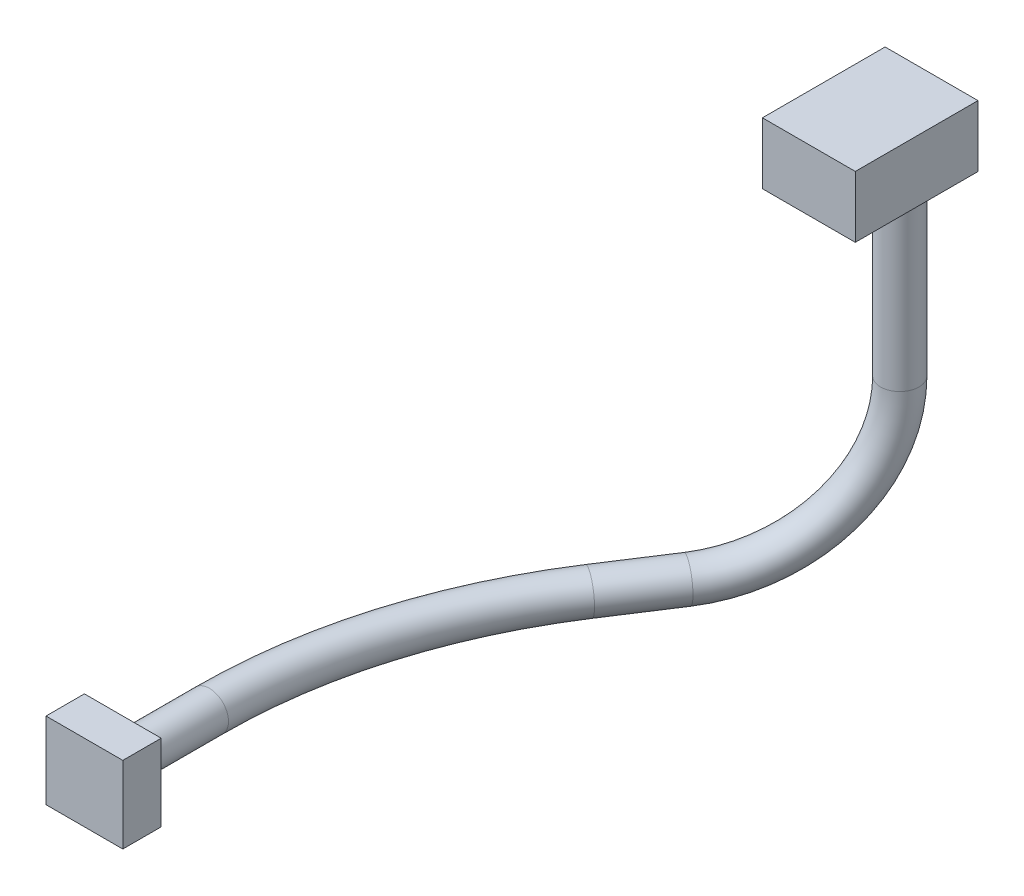
ISO-10303-21;
HEADER;
FILE_DESCRIPTION(('STEP AP214'),'2;1');
FILE_NAME('part.step','',(''),(''),'','','');
FILE_SCHEMA(('AUTOMOTIVE_DESIGN { 1 0 10303 214 1 1 1 1 }'));
ENDSEC;
DATA;
#1=APPLICATION_CONTEXT('core data for automotive mechanical design processes');
#2=APPLICATION_PROTOCOL_DEFINITION('international standard','automotive_design',2000,#1);
#3=PRODUCT_CONTEXT('',#1,'mechanical');
#4=PRODUCT('Part','Part','',(#3));
#5=PRODUCT_RELATED_PRODUCT_CATEGORY('part','',(#4));
#6=PRODUCT_DEFINITION_FORMATION('','',#4);
#7=PRODUCT_DEFINITION_CONTEXT('part definition',#1,'design');
#8=PRODUCT_DEFINITION('design','',#6,#7);
#9=PRODUCT_DEFINITION_SHAPE('','',#8);
#10=(LENGTH_UNIT() NAMED_UNIT(*) SI_UNIT(.MILLI.,.METRE.));
#11=(NAMED_UNIT(*) PLANE_ANGLE_UNIT() SI_UNIT($,.RADIAN.));
#12=(NAMED_UNIT(*) SI_UNIT($,.STERADIAN.) SOLID_ANGLE_UNIT());
#13=UNCERTAINTY_MEASURE_WITH_UNIT(LENGTH_MEASURE(1.E-05),#10,'distance_accuracy_value','');
#14=(GEOMETRIC_REPRESENTATION_CONTEXT(3) GLOBAL_UNCERTAINTY_ASSIGNED_CONTEXT((#13)) GLOBAL_UNIT_ASSIGNED_CONTEXT((#10,
#11,#12)) REPRESENTATION_CONTEXT('',''));
#15=CARTESIAN_POINT('',(0.,0.,0.));
#16=DIRECTION('',(0.,0.,1.));
#17=DIRECTION('',(1.,0.,0.));
#18=AXIS2_PLACEMENT_3D('',#15,#16,#17);
#19=CARTESIAN_POINT('',(0.,0.,0.));
#20=DIRECTION('',(0.,0.,-1.));
#21=DIRECTION('',(-1.,0.,0.));
#22=AXIS2_PLACEMENT_3D('',#19,#20,#21);
#23=CYLINDRICAL_SURFACE('',#22,2.5);
#24=CARTESIAN_POINT('',(0.,0.,-11.2650553526543));
#25=DIRECTION('',(0.,0.,1.));
#26=DIRECTION('',(0.838670567945424,-0.544639035015028,0.));
#27=AXIS2_PLACEMENT_3D('',#24,#25,#26);
#28=CIRCLE('',#27,2.5);
#29=CARTESIAN_POINT('',(-2.5,0.,-11.2650553526543));
#30=VERTEX_POINT('',#29);
#31=EDGE_CURVE('E184',#30,#30,#28,.T.);
#32=ORIENTED_EDGE('',*,*,#31,.T.);
#33=EDGE_LOOP('',(#32));
#34=FACE_BOUND('',#33,.T.);
#35=CARTESIAN_POINT('',(0.,0.,0.));
#36=DIRECTION('',(0.,0.,1.));
#37=DIRECTION('',(0.838670567945424,-0.544639035015028,0.));
#38=AXIS2_PLACEMENT_3D('',#35,#36,#37);
#39=CIRCLE('',#38,2.5);
#40=CARTESIAN_POINT('',(2.09667641986356,-1.36159758753757,0.));
#41=VERTEX_POINT('',#40);
#42=EDGE_CURVE('E181',#41,#41,#39,.T.);
#43=ORIENTED_EDGE('',*,*,#42,.F.);
#44=EDGE_LOOP('',(#43));
#45=FACE_BOUND('',#44,.T.);
#46=ADVANCED_FACE('F52',(#34,#45),#23,.T.);
#47=CARTESIAN_POINT('',(70.,0.,-11.2650553526543));
#48=DIRECTION('',(0.,-1.,0.));
#49=DIRECTION('',(0.,0.,-1.));
#50=AXIS2_PLACEMENT_3D('',#47,#48,#49);
#51=TOROIDAL_SURFACE('',#50,70.,2.5);
#52=CARTESIAN_POINT('',(11.2930602438204,0.,-49.3897878037063));
#53=DIRECTION('',(-0.544639035015029,0.,0.838670567945423));
#54=DIRECTION('',(0.703368321537899,-0.544639035015028,0.456772728821302));
#55=AXIS2_PLACEMENT_3D('',#52,#53,#54);
#56=CIRCLE('',#55,2.5);
#57=CARTESIAN_POINT('',(9.19638382395683,0.,-50.7513853912439));
#58=VERTEX_POINT('',#57);
#59=EDGE_CURVE('E187',#58,#58,#56,.T.);
#60=CARTESIAN_POINT('',(70.,0.,-11.2650553526543));
#61=DIRECTION('',(0.,-1.,0.));
#62=DIRECTION('',(0.,0.,-1.));
#63=AXIS2_PLACEMENT_3D('',#60,#61,#62);
#64=CIRCLE('',#63,72.5);
#65=EDGE_CURVE('',#30,#58,#64,.T.);
#66=ORIENTED_EDGE('',*,*,#31,.F.);
#67=ORIENTED_EDGE('',*,*,#59,.T.);
#68=ORIENTED_EDGE('',*,*,#65,.T.);
#69=ORIENTED_EDGE('',*,*,#65,.F.);
#70=EDGE_LOOP('',(#66,#68,#67,#69));
#71=FACE_BOUND('',#70,.T.);
#72=ADVANCED_FACE('F205',(#71),#51,.T.);
#73=CARTESIAN_POINT('',(11.2930602438204,0.,-49.3897878037063));
#74=DIRECTION('',(0.544639035015028,0.,-0.838670567945423));
#75=DIRECTION('',(-0.838670567945423,0.,-0.544639035015028));
#76=AXIS2_PLACEMENT_3D('',#73,#74,#75);
#77=CYLINDRICAL_SURFACE('',#76,2.5);
#78=CARTESIAN_POINT('',(16.3391710504509,0.,-57.1601170383627));
#79=DIRECTION('',(-0.544639035015028,0.,0.838670567945423));
#80=DIRECTION('',(0.703368321537899,-0.544639035015028,0.456772728821301));
#81=AXIS2_PLACEMENT_3D('',#78,#79,#80);
#82=CIRCLE('',#81,2.5);
#83=CARTESIAN_POINT('',(16.3391710504509,-2.5,-57.1601170383627));
#84=VERTEX_POINT('',#83);
#85=EDGE_CURVE('E62',#84,#84,#82,.T.);
#86=ORIENTED_EDGE('',*,*,#85,.T.);
#87=EDGE_LOOP('',(#86));
#88=FACE_BOUND('',#87,.T.);
#89=ORIENTED_EDGE('',*,*,#59,.F.);
#90=EDGE_LOOP('',(#89));
#91=FACE_BOUND('',#90,.T.);
#92=ADVANCED_FACE('F193',(#88,#91),#77,.T.);
#93=CARTESIAN_POINT('',(16.3391710504508,20.,-57.1601170383627));
#94=DIRECTION('',(0.838670567945424,0.,0.544639035015028));
#95=DIRECTION('',(0.544639035015028,0.,-0.838670567945424));
#96=AXIS2_PLACEMENT_3D('',#93,#94,#95);
#97=TOROIDAL_SURFACE('',#96,20.,2.5);
#98=CARTESIAN_POINT('',(27.2319517507514,20.,-73.9335283972712));
#99=DIRECTION('',(0.,-1.,0.));
#100=DIRECTION('',(1.,0.,0.));
#101=AXIS2_PLACEMENT_3D('',#98,#99,#100);
#102=CIRCLE('',#101,2.5);
#103=CARTESIAN_POINT('',(28.593549338289,20.,-76.0302048171348));
#104=VERTEX_POINT('',#103);
#105=EDGE_CURVE('E12',#104,#104,#102,.T.);
#106=CARTESIAN_POINT('',(16.3391710504508,20.,-57.1601170383627));
#107=DIRECTION('',(0.838670567945424,0.,0.544639035015028));
#108=DIRECTION('',(0.544639035015028,0.,-0.838670567945424));
#109=AXIS2_PLACEMENT_3D('',#106,#107,#108);
#110=CIRCLE('',#109,22.5);
#111=EDGE_CURVE('',#84,#104,#110,.T.);
#112=ORIENTED_EDGE('',*,*,#85,.F.);
#113=ORIENTED_EDGE('',*,*,#105,.T.);
#114=ORIENTED_EDGE('',*,*,#111,.T.);
#115=ORIENTED_EDGE('',*,*,#111,.F.);
#116=EDGE_LOOP('',(#112,#114,#113,#115));
#117=FACE_BOUND('',#116,.T.);
#118=ADVANCED_FACE('F196',(#117),#97,.T.);
#119=CARTESIAN_POINT('',(27.2319517507514,20.,-73.9335283972712));
#120=DIRECTION('',(0.,1.,0.));
#121=DIRECTION('',(-1.,0.,0.));
#122=AXIS2_PLACEMENT_3D('',#119,#120,#121);
#123=CYLINDRICAL_SURFACE('',#122,2.5);
#124=CARTESIAN_POINT('',(27.2319517507514,44.,-73.9335283972712));
#125=DIRECTION('',(0.,-1.,0.));
#126=DIRECTION('',(1.,0.,0.));
#127=AXIS2_PLACEMENT_3D('',#124,#125,#126);
#128=CIRCLE('',#127,2.5);
#129=CARTESIAN_POINT('',(29.7319517507514,44.,-73.9335283972712));
#130=VERTEX_POINT('',#129);
#131=EDGE_CURVE('E56',#130,#130,#128,.T.);
#132=ORIENTED_EDGE('',*,*,#131,.T.);
#133=EDGE_LOOP('',(#132));
#134=FACE_BOUND('',#133,.T.);
#135=ORIENTED_EDGE('',*,*,#105,.F.);
#136=EDGE_LOOP('',(#135));
#137=FACE_BOUND('',#136,.T.);
#138=ADVANCED_FACE('F54',(#134,#137),#123,.T.);
#139=CARTESIAN_POINT('',(5.,5.,5.));
#140=DIRECTION('',(-1.,0.,0.));
#141=DIRECTION('',(0.,-1.,0.));
#142=AXIS2_PLACEMENT_3D('',#139,#140,#141);
#143=PLANE('',#142);
#144=DIRECTION('',(0.,1.,0.));
#145=VECTOR('',#144,1.);
#146=CARTESIAN_POINT('',(5.,5.,0.));
#147=LINE('',#146,#145);
#148=CARTESIAN_POINT('',(5.,-5.,0.));
#149=VERTEX_POINT('',#148);
#150=CARTESIAN_POINT('',(5.,5.,0.));
#151=VERTEX_POINT('',#150);
#152=EDGE_CURVE('E156',#149,#151,#147,.T.);
#153=ORIENTED_EDGE('',*,*,#152,.T.);
#154=DIRECTION('',(0.,0.,-1.));
#155=VECTOR('',#154,1.);
#156=CARTESIAN_POINT('',(5.,5.,5.));
#157=LINE('',#156,#155);
#158=CARTESIAN_POINT('',(5.,5.,5.));
#159=VERTEX_POINT('',#158);
#160=EDGE_CURVE('E179',#159,#151,#157,.T.);
#161=ORIENTED_EDGE('',*,*,#160,.F.);
#162=DIRECTION('',(0.,1.,0.));
#163=VECTOR('',#162,1.);
#164=CARTESIAN_POINT('',(5.,5.,5.));
#165=LINE('',#164,#163);
#166=CARTESIAN_POINT('',(5.,-5.,5.));
#167=VERTEX_POINT('',#166);
#168=EDGE_CURVE('E161',#167,#159,#165,.T.);
#169=ORIENTED_EDGE('',*,*,#168,.F.);
#170=DIRECTION('',(0.,0.,-1.));
#171=VECTOR('',#170,1.);
#172=CARTESIAN_POINT('',(5.,-5.,5.));
#173=LINE('',#172,#171);
#174=EDGE_CURVE('E167',#167,#149,#173,.T.);
#175=ORIENTED_EDGE('',*,*,#174,.T.);
#176=EDGE_LOOP('',(#153,#161,#169,#175));
#177=FACE_BOUND('',#176,.T.);
#178=ADVANCED_FACE('F203',(#177),#143,.F.);
#179=CARTESIAN_POINT('',(-5.,5.,5.));
#180=DIRECTION('',(0.,-1.,0.));
#181=DIRECTION('',(0.,0.,-1.));
#182=AXIS2_PLACEMENT_3D('',#179,#180,#181);
#183=PLANE('',#182);
#184=DIRECTION('',(-1.,0.,0.));
#185=VECTOR('',#184,1.);
#186=CARTESIAN_POINT('',(-5.,5.,0.));
#187=LINE('',#186,#185);
#188=CARTESIAN_POINT('',(-5.,5.,0.));
#189=VERTEX_POINT('',#188);
#190=EDGE_CURVE('E170',#151,#189,#187,.T.);
#191=ORIENTED_EDGE('',*,*,#190,.T.);
#192=DIRECTION('',(0.,0.,-1.));
#193=VECTOR('',#192,1.);
#194=CARTESIAN_POINT('',(-5.,5.,5.));
#195=LINE('',#194,#193);
#196=CARTESIAN_POINT('',(-5.,5.,5.));
#197=VERTEX_POINT('',#196);
#198=EDGE_CURVE('E177',#197,#189,#195,.T.);
#199=ORIENTED_EDGE('',*,*,#198,.F.);
#200=DIRECTION('',(-1.,0.,0.));
#201=VECTOR('',#200,1.);
#202=CARTESIAN_POINT('',(-5.,5.,5.));
#203=LINE('',#202,#201);
#204=EDGE_CURVE('E102',#159,#197,#203,.T.);
#205=ORIENTED_EDGE('',*,*,#204,.F.);
#206=ORIENTED_EDGE('',*,*,#160,.T.);
#207=EDGE_LOOP('',(#191,#199,#205,#206));
#208=FACE_BOUND('',#207,.T.);
#209=ADVANCED_FACE('F216',(#208),#183,.F.);
#210=CARTESIAN_POINT('',(-5.,5.,5.));
#211=DIRECTION('',(1.,0.,0.));
#212=DIRECTION('',(0.,1.,0.));
#213=AXIS2_PLACEMENT_3D('',#210,#211,#212);
#214=PLANE('',#213);
#215=DIRECTION('',(0.,-1.,0.));
#216=VECTOR('',#215,1.);
#217=CARTESIAN_POINT('',(-5.,5.,0.));
#218=LINE('',#217,#216);
#219=CARTESIAN_POINT('',(-5.,-5.,0.));
#220=VERTEX_POINT('',#219);
#221=EDGE_CURVE('E88',#189,#220,#218,.T.);
#222=ORIENTED_EDGE('',*,*,#221,.T.);
#223=DIRECTION('',(0.,0.,-1.));
#224=VECTOR('',#223,1.);
#225=CARTESIAN_POINT('',(-5.,-5.,5.));
#226=LINE('',#225,#224);
#227=CARTESIAN_POINT('',(-5.,-5.,5.));
#228=VERTEX_POINT('',#227);
#229=EDGE_CURVE('E175',#228,#220,#226,.T.);
#230=ORIENTED_EDGE('',*,*,#229,.F.);
#231=DIRECTION('',(0.,-1.,0.));
#232=VECTOR('',#231,1.);
#233=CARTESIAN_POINT('',(-5.,5.,5.));
#234=LINE('',#233,#232);
#235=EDGE_CURVE('E164',#197,#228,#234,.T.);
#236=ORIENTED_EDGE('',*,*,#235,.F.);
#237=ORIENTED_EDGE('',*,*,#198,.T.);
#238=EDGE_LOOP('',(#222,#230,#236,#237));
#239=FACE_BOUND('',#238,.T.);
#240=ADVANCED_FACE('F220',(#239),#214,.F.);
#241=CARTESIAN_POINT('',(-5.,-5.,5.));
#242=DIRECTION('',(0.,1.,0.));
#243=DIRECTION('',(0.,0.,1.));
#244=AXIS2_PLACEMENT_3D('',#241,#242,#243);
#245=PLANE('',#244);
#246=DIRECTION('',(1.,0.,0.));
#247=VECTOR('',#246,1.);
#248=CARTESIAN_POINT('',(-5.,-5.,0.));
#249=LINE('',#248,#247);
#250=EDGE_CURVE('E94',#220,#149,#249,.T.);
#251=ORIENTED_EDGE('',*,*,#250,.T.);
#252=ORIENTED_EDGE('',*,*,#174,.F.);
#253=DIRECTION('',(1.,0.,0.));
#254=VECTOR('',#253,1.);
#255=CARTESIAN_POINT('',(-5.,-5.,5.));
#256=LINE('',#255,#254);
#257=EDGE_CURVE('E70',#228,#167,#256,.T.);
#258=ORIENTED_EDGE('',*,*,#257,.F.);
#259=ORIENTED_EDGE('',*,*,#229,.T.);
#260=EDGE_LOOP('',(#251,#252,#258,#259));
#261=FACE_BOUND('',#260,.T.);
#262=ADVANCED_FACE('F223',(#261),#245,.F.);
#263=CARTESIAN_POINT('',(0.,0.,5.));
#264=DIRECTION('',(0.,0.,1.));
#265=DIRECTION('',(1.,0.,0.));
#266=AXIS2_PLACEMENT_3D('',#263,#264,#265);
#267=PLANE('',#266);
#268=ORIENTED_EDGE('',*,*,#168,.T.);
#269=ORIENTED_EDGE('',*,*,#204,.T.);
#270=ORIENTED_EDGE('',*,*,#235,.T.);
#271=ORIENTED_EDGE('',*,*,#257,.T.);
#272=EDGE_LOOP('',(#268,#269,#270,#271));
#273=FACE_BOUND('',#272,.T.);
#274=ADVANCED_FACE('F226',(#273),#267,.T.);
#275=CARTESIAN_POINT('',(0.,0.,0.));
#276=DIRECTION('',(0.,0.,1.));
#277=DIRECTION('',(1.,0.,0.));
#278=AXIS2_PLACEMENT_3D('',#275,#276,#277);
#279=PLANE('',#278);
#280=ORIENTED_EDGE('',*,*,#42,.T.);
#281=EDGE_LOOP('',(#280));
#282=FACE_BOUND('',#281,.T.);
#283=ORIENTED_EDGE('',*,*,#152,.F.);
#284=ORIENTED_EDGE('',*,*,#250,.F.);
#285=ORIENTED_EDGE('',*,*,#221,.F.);
#286=ORIENTED_EDGE('',*,*,#190,.F.);
#287=EDGE_LOOP('',(#283,#284,#285,#286));
#288=FACE_BOUND('',#287,.T.);
#289=ADVANCED_FACE('F227',(#282,#288),#279,.F.);
#290=CARTESIAN_POINT('',(21.1852247097513,52.,-78.070467629394));
#291=DIRECTION('',(1.,0.,0.));
#292=DIRECTION('',(0.,0.,-1.));
#293=AXIS2_PLACEMENT_3D('',#290,#291,#292);
#294=PLANE('',#293);
#295=DIRECTION('',(0.,0.,1.));
#296=VECTOR('',#295,1.);
#297=CARTESIAN_POINT('',(21.1852247097513,44.,-78.070467629394));
#298=LINE('',#297,#296);
#299=CARTESIAN_POINT('',(21.1852247097513,44.,-78.070467629394));
#300=VERTEX_POINT('',#299);
#301=CARTESIAN_POINT('',(21.1852247097513,44.,-62.0943429830169));
#302=VERTEX_POINT('',#301);
#303=EDGE_CURVE('E153',#300,#302,#298,.T.);
#304=ORIENTED_EDGE('',*,*,#303,.T.);
#305=DIRECTION('',(0.,-1.,0.));
#306=VECTOR('',#305,1.);
#307=CARTESIAN_POINT('',(21.1852247097513,52.,-62.0943429830169));
#308=LINE('',#307,#306);
#309=CARTESIAN_POINT('',(21.1852247097513,52.,-62.0943429830169));
#310=VERTEX_POINT('',#309);
#311=EDGE_CURVE('E133',#310,#302,#308,.T.);
#312=ORIENTED_EDGE('',*,*,#311,.F.);
#313=DIRECTION('',(0.,0.,1.));
#314=VECTOR('',#313,1.);
#315=CARTESIAN_POINT('',(21.1852247097513,52.,-78.070467629394));
#316=LINE('',#315,#314);
#317=CARTESIAN_POINT('',(21.1852247097513,52.,-78.070467629394));
#318=VERTEX_POINT('',#317);
#319=EDGE_CURVE('E140',#318,#310,#316,.T.);
#320=ORIENTED_EDGE('',*,*,#319,.F.);
#321=DIRECTION('',(0.,-1.,0.));
#322=VECTOR('',#321,1.);
#323=CARTESIAN_POINT('',(21.1852247097513,52.,-78.070467629394));
#324=LINE('',#323,#322);
#325=EDGE_CURVE('E397',#318,#300,#324,.T.);
#326=ORIENTED_EDGE('',*,*,#325,.T.);
#327=EDGE_LOOP('',(#304,#312,#320,#326));
#328=FACE_BOUND('',#327,.T.);
#329=ADVANCED_FACE('F151',(#328),#294,.F.);
#330=CARTESIAN_POINT('',(21.1852247097513,52.,-62.0943429830169));
#331=DIRECTION('',(0.,0.,-1.));
#332=DIRECTION('',(-1.,0.,0.));
#333=AXIS2_PLACEMENT_3D('',#330,#331,#332);
#334=PLANE('',#333);
#335=DIRECTION('',(1.,0.,0.));
#336=VECTOR('',#335,1.);
#337=CARTESIAN_POINT('',(21.1852247097513,44.,-62.0943429830169));
#338=LINE('',#337,#336);
#339=CARTESIAN_POINT('',(33.2786787917515,44.,-62.0943429830169));
#340=VERTEX_POINT('',#339);
#341=EDGE_CURVE('E388',#302,#340,#338,.T.);
#342=ORIENTED_EDGE('',*,*,#341,.T.);
#343=DIRECTION('',(0.,-1.,0.));
#344=VECTOR('',#343,1.);
#345=CARTESIAN_POINT('',(33.2786787917515,52.,-62.0943429830169));
#346=LINE('',#345,#344);
#347=CARTESIAN_POINT('',(33.2786787917515,52.,-62.0943429830169));
#348=VERTEX_POINT('',#347);
#349=EDGE_CURVE('E136',#348,#340,#346,.T.);
#350=ORIENTED_EDGE('',*,*,#349,.F.);
#351=DIRECTION('',(1.,0.,0.));
#352=VECTOR('',#351,1.);
#353=CARTESIAN_POINT('',(21.1852247097513,52.,-62.0943429830169));
#354=LINE('',#353,#352);
#355=EDGE_CURVE('E129',#310,#348,#354,.T.);
#356=ORIENTED_EDGE('',*,*,#355,.F.);
#357=ORIENTED_EDGE('',*,*,#311,.T.);
#358=EDGE_LOOP('',(#342,#350,#356,#357));
#359=FACE_BOUND('',#358,.T.);
#360=ADVANCED_FACE('F131',(#359),#334,.F.);
#361=CARTESIAN_POINT('',(33.2786787917515,52.,-78.070467629394));
#362=DIRECTION('',(-1.,0.,0.));
#363=DIRECTION('',(0.,0.,1.));
#364=AXIS2_PLACEMENT_3D('',#361,#362,#363);
#365=PLANE('',#364);
#366=DIRECTION('',(0.,0.,-1.));
#367=VECTOR('',#366,1.);
#368=CARTESIAN_POINT('',(33.2786787917515,44.,-78.070467629394));
#369=LINE('',#368,#367);
#370=CARTESIAN_POINT('',(33.2786787917515,44.,-78.070467629394));
#371=VERTEX_POINT('',#370);
#372=EDGE_CURVE('E390',#340,#371,#369,.T.);
#373=ORIENTED_EDGE('',*,*,#372,.T.);
#374=DIRECTION('',(0.,-1.,0.));
#375=VECTOR('',#374,1.);
#376=CARTESIAN_POINT('',(33.2786787917515,52.,-78.070467629394));
#377=LINE('',#376,#375);
#378=CARTESIAN_POINT('',(33.2786787917515,52.,-78.070467629394));
#379=VERTEX_POINT('',#378);
#380=EDGE_CURVE('E157',#379,#371,#377,.T.);
#381=ORIENTED_EDGE('',*,*,#380,.F.);
#382=DIRECTION('',(0.,0.,-1.));
#383=VECTOR('',#382,1.);
#384=CARTESIAN_POINT('',(33.2786787917515,52.,-78.070467629394));
#385=LINE('',#384,#383);
#386=EDGE_CURVE('E139',#348,#379,#385,.T.);
#387=ORIENTED_EDGE('',*,*,#386,.F.);
#388=ORIENTED_EDGE('',*,*,#349,.T.);
#389=EDGE_LOOP('',(#373,#381,#387,#388));
#390=FACE_BOUND('',#389,.T.);
#391=ADVANCED_FACE('F237',(#390),#365,.F.);
#392=CARTESIAN_POINT('',(21.1852247097513,52.,-78.070467629394));
#393=DIRECTION('',(0.,0.,1.));
#394=DIRECTION('',(1.,0.,0.));
#395=AXIS2_PLACEMENT_3D('',#392,#393,#394);
#396=PLANE('',#395);
#397=DIRECTION('',(-1.,0.,0.));
#398=VECTOR('',#397,1.);
#399=CARTESIAN_POINT('',(21.1852247097513,44.,-78.070467629394));
#400=LINE('',#399,#398);
#401=EDGE_CURVE('E149',#371,#300,#400,.T.);
#402=ORIENTED_EDGE('',*,*,#401,.T.);
#403=ORIENTED_EDGE('',*,*,#325,.F.);
#404=DIRECTION('',(-1.,0.,0.));
#405=VECTOR('',#404,1.);
#406=CARTESIAN_POINT('',(21.1852247097513,52.,-78.070467629394));
#407=LINE('',#406,#405);
#408=EDGE_CURVE('E145',#379,#318,#407,.T.);
#409=ORIENTED_EDGE('',*,*,#408,.F.);
#410=ORIENTED_EDGE('',*,*,#380,.T.);
#411=EDGE_LOOP('',(#402,#403,#409,#410));
#412=FACE_BOUND('',#411,.T.);
#413=ADVANCED_FACE('F240',(#412),#396,.F.);
#414=CARTESIAN_POINT('',(0.,52.,0.));
#415=DIRECTION('',(0.,1.,0.));
#416=DIRECTION('',(0.,0.,1.));
#417=AXIS2_PLACEMENT_3D('',#414,#415,#416);
#418=PLANE('',#417);
#419=ORIENTED_EDGE('',*,*,#319,.T.);
#420=ORIENTED_EDGE('',*,*,#355,.T.);
#421=ORIENTED_EDGE('',*,*,#386,.T.);
#422=ORIENTED_EDGE('',*,*,#408,.T.);
#423=EDGE_LOOP('',(#419,#420,#421,#422));
#424=FACE_BOUND('',#423,.T.);
#425=ADVANCED_FACE('F143',(#424),#418,.T.);
#426=CARTESIAN_POINT('',(0.,44.,0.));
#427=DIRECTION('',(0.,1.,0.));
#428=DIRECTION('',(0.,0.,1.));
#429=AXIS2_PLACEMENT_3D('',#426,#427,#428);
#430=PLANE('',#429);
#431=ORIENTED_EDGE('',*,*,#131,.F.);
#432=EDGE_LOOP('',(#431));
#433=FACE_BOUND('',#432,.T.);
#434=ORIENTED_EDGE('',*,*,#303,.F.);
#435=ORIENTED_EDGE('',*,*,#401,.F.);
#436=ORIENTED_EDGE('',*,*,#372,.F.);
#437=ORIENTED_EDGE('',*,*,#341,.F.);
#438=EDGE_LOOP('',(#434,#435,#436,#437));
#439=FACE_BOUND('',#438,.T.);
#440=ADVANCED_FACE('F245',(#433,#439),#430,.F.);
#441=CLOSED_SHELL('',(#46,#72,#92,#118,#138,#178,#209,#240,#262,#274,#289,#329,#360,#391,#413,
#425,#440));
#442=MANIFOLD_SOLID_BREP('B2',#441);
#443=ADVANCED_BREP_SHAPE_REPRESENTATION('',(#18,#442),#14);
#444=SHAPE_DEFINITION_REPRESENTATION(#9,#443);
ENDSEC;
END-ISO-10303-21;
